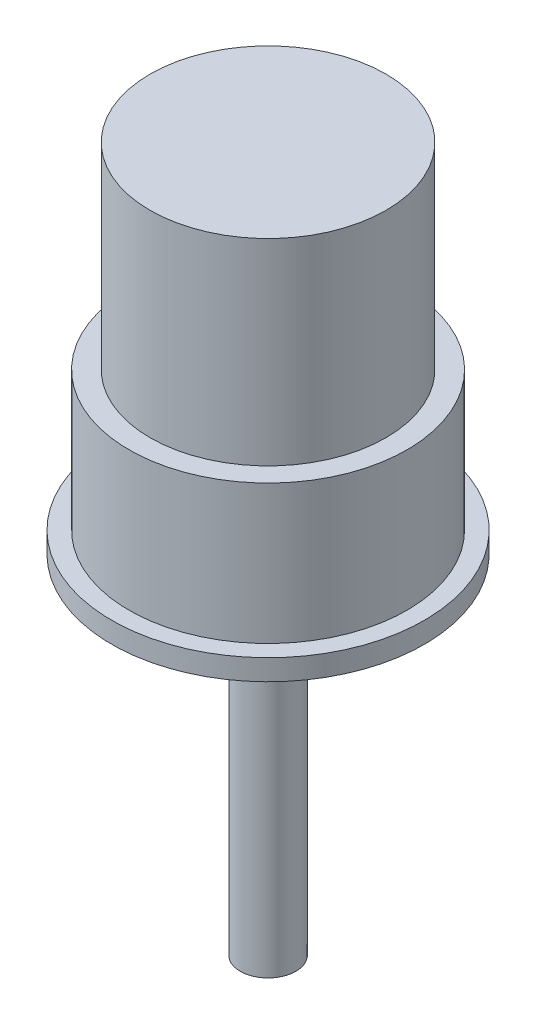
ISO-10303-21;
HEADER;
FILE_DESCRIPTION(('STEP AP214'),'2;1');
FILE_NAME('part.step','',(''),(''),'','','');
FILE_SCHEMA(('AUTOMOTIVE_DESIGN { 1 0 10303 214 1 1 1 1 }'));
ENDSEC;
DATA;
#1=APPLICATION_CONTEXT('core data for automotive mechanical design processes');
#2=APPLICATION_PROTOCOL_DEFINITION('international standard','automotive_design',2000,#1);
#3=PRODUCT_CONTEXT('',#1,'mechanical');
#4=PRODUCT('Part','Part','',(#3));
#5=PRODUCT_RELATED_PRODUCT_CATEGORY('part','',(#4));
#6=PRODUCT_DEFINITION_FORMATION('','',#4);
#7=PRODUCT_DEFINITION_CONTEXT('part definition',#1,'design');
#8=PRODUCT_DEFINITION('design','',#6,#7);
#9=PRODUCT_DEFINITION_SHAPE('','',#8);
#10=(LENGTH_UNIT() NAMED_UNIT(*) SI_UNIT(.MILLI.,.METRE.));
#11=(NAMED_UNIT(*) PLANE_ANGLE_UNIT() SI_UNIT($,.RADIAN.));
#12=(NAMED_UNIT(*) SI_UNIT($,.STERADIAN.) SOLID_ANGLE_UNIT());
#13=UNCERTAINTY_MEASURE_WITH_UNIT(LENGTH_MEASURE(1.E-05),#10,'distance_accuracy_value','');
#14=(GEOMETRIC_REPRESENTATION_CONTEXT(3) GLOBAL_UNCERTAINTY_ASSIGNED_CONTEXT((#13)) GLOBAL_UNIT_ASSIGNED_CONTEXT((#10,
#11,#12)) REPRESENTATION_CONTEXT('',''));
#15=CARTESIAN_POINT('',(0.,0.,0.));
#16=DIRECTION('',(0.,0.,1.));
#17=DIRECTION('',(1.,0.,0.));
#18=AXIS2_PLACEMENT_3D('',#15,#16,#17);
#19=CARTESIAN_POINT('',(0.,0.,0.));
#20=DIRECTION('',(0.,-1.,0.));
#21=DIRECTION('',(0.,0.,-1.));
#22=AXIS2_PLACEMENT_3D('',#19,#20,#21);
#23=PLANE('',#22);
#24=CARTESIAN_POINT('',(0.,0.,0.));
#25=DIRECTION('',(0.,-1.,0.));
#26=DIRECTION('',(0.,0.,-1.));
#27=AXIS2_PLACEMENT_3D('',#24,#25,#26);
#28=CIRCLE('',#27,16.9815);
#29=CARTESIAN_POINT('',(0.,0.,-16.9815));
#30=VERTEX_POINT('',#29);
#31=EDGE_CURVE('E10',#30,#30,#28,.T.);
#32=ORIENTED_EDGE('',*,*,#31,.F.);
#33=EDGE_LOOP('',(#32));
#34=FACE_BOUND('',#33,.T.);
#35=ADVANCED_FACE('F35',(#34),#23,.F.);
#36=CARTESIAN_POINT('',(0.,0.,0.));
#37=DIRECTION('',(0.,-1.,0.));
#38=DIRECTION('',(0.,0.,-1.));
#39=AXIS2_PLACEMENT_3D('',#36,#37,#38);
#40=CYLINDRICAL_SURFACE('',#39,16.9815);
#41=CARTESIAN_POINT('',(0.,-28.34,0.));
#42=DIRECTION('',(0.,-1.,0.));
#43=DIRECTION('',(0.,0.,-1.));
#44=AXIS2_PLACEMENT_3D('',#41,#42,#43);
#45=CIRCLE('',#44,16.9815);
#46=CARTESIAN_POINT('',(0.,-28.34,-16.9815));
#47=VERTEX_POINT('',#46);
#48=EDGE_CURVE('E41',#47,#47,#45,.T.);
#49=ORIENTED_EDGE('',*,*,#48,.F.);
#50=EDGE_LOOP('',(#49));
#51=FACE_BOUND('',#50,.T.);
#52=ORIENTED_EDGE('',*,*,#31,.T.);
#53=EDGE_LOOP('',(#52));
#54=FACE_BOUND('',#53,.T.);
#55=ADVANCED_FACE('F101',(#51,#54),#40,.T.);
#56=CARTESIAN_POINT('',(-16.9815,-28.34,0.));
#57=DIRECTION('',(0.,-1.,0.));
#58=DIRECTION('',(0.,0.,-1.));
#59=AXIS2_PLACEMENT_3D('',#56,#57,#58);
#60=PLANE('',#59);
#61=CARTESIAN_POINT('',(0.,-28.34,0.));
#62=DIRECTION('',(0.,-1.,0.));
#63=DIRECTION('',(0.,0.,-1.));
#64=AXIS2_PLACEMENT_3D('',#61,#62,#63);
#65=CIRCLE('',#64,20.);
#66=CARTESIAN_POINT('',(0.,-28.34,-20.));
#67=VERTEX_POINT('',#66);
#68=EDGE_CURVE('E45',#67,#67,#65,.T.);
#69=ORIENTED_EDGE('',*,*,#68,.F.);
#70=EDGE_LOOP('',(#69));
#71=FACE_BOUND('',#70,.T.);
#72=ORIENTED_EDGE('',*,*,#48,.T.);
#73=EDGE_LOOP('',(#72));
#74=FACE_BOUND('',#73,.T.);
#75=ADVANCED_FACE('F96',(#71,#74),#60,.F.);
#76=CARTESIAN_POINT('',(0.,0.,0.));
#77=DIRECTION('',(0.,-1.,0.));
#78=DIRECTION('',(0.,0.,-1.));
#79=AXIS2_PLACEMENT_3D('',#76,#77,#78);
#80=CYLINDRICAL_SURFACE('',#79,20.);
#81=CARTESIAN_POINT('',(0.,-48.34,0.));
#82=DIRECTION('',(0.,-1.,0.));
#83=DIRECTION('',(0.,0.,-1.));
#84=AXIS2_PLACEMENT_3D('',#81,#82,#83);
#85=CIRCLE('',#84,20.);
#86=CARTESIAN_POINT('',(0.,-48.34,-20.));
#87=VERTEX_POINT('',#86);
#88=EDGE_CURVE('E49',#87,#87,#85,.T.);
#89=ORIENTED_EDGE('',*,*,#88,.F.);
#90=EDGE_LOOP('',(#89));
#91=FACE_BOUND('',#90,.T.);
#92=ORIENTED_EDGE('',*,*,#68,.T.);
#93=EDGE_LOOP('',(#92));
#94=FACE_BOUND('',#93,.T.);
#95=ADVANCED_FACE('F90',(#91,#94),#80,.T.);
#96=CARTESIAN_POINT('',(-20.,-48.34,0.));
#97=DIRECTION('',(0.,-1.,0.));
#98=DIRECTION('',(0.,0.,-1.));
#99=AXIS2_PLACEMENT_3D('',#96,#97,#98);
#100=PLANE('',#99);
#101=CARTESIAN_POINT('',(0.,-48.34,0.));
#102=DIRECTION('',(0.,-1.,0.));
#103=DIRECTION('',(0.,0.,-1.));
#104=AXIS2_PLACEMENT_3D('',#101,#102,#103);
#105=CIRCLE('',#104,22.5);
#106=CARTESIAN_POINT('',(0.,-48.34,-22.5));
#107=VERTEX_POINT('',#106);
#108=EDGE_CURVE('E54',#107,#107,#105,.T.);
#109=ORIENTED_EDGE('',*,*,#108,.F.);
#110=EDGE_LOOP('',(#109));
#111=FACE_BOUND('',#110,.T.);
#112=ORIENTED_EDGE('',*,*,#88,.T.);
#113=EDGE_LOOP('',(#112));
#114=FACE_BOUND('',#113,.T.);
#115=ADVANCED_FACE('F84',(#111,#114),#100,.F.);
#116=CARTESIAN_POINT('',(0.,0.,0.));
#117=DIRECTION('',(0.,-1.,0.));
#118=DIRECTION('',(0.,0.,-1.));
#119=AXIS2_PLACEMENT_3D('',#116,#117,#118);
#120=CYLINDRICAL_SURFACE('',#119,22.5);
#121=CARTESIAN_POINT('',(0.,-51.34,0.));
#122=DIRECTION('',(0.,-1.,0.));
#123=DIRECTION('',(0.,0.,-1.));
#124=AXIS2_PLACEMENT_3D('',#121,#122,#123);
#125=CIRCLE('',#124,22.5);
#126=CARTESIAN_POINT('',(0.,-51.34,-22.5));
#127=VERTEX_POINT('',#126);
#128=EDGE_CURVE('E57',#127,#127,#125,.T.);
#129=ORIENTED_EDGE('',*,*,#128,.F.);
#130=EDGE_LOOP('',(#129));
#131=FACE_BOUND('',#130,.T.);
#132=ORIENTED_EDGE('',*,*,#108,.T.);
#133=EDGE_LOOP('',(#132));
#134=FACE_BOUND('',#133,.T.);
#135=ADVANCED_FACE('F78',(#131,#134),#120,.T.);
#136=CARTESIAN_POINT('',(-22.5,-51.34,0.));
#137=DIRECTION('',(0.,1.,0.));
#138=DIRECTION('',(0.,0.,1.));
#139=AXIS2_PLACEMENT_3D('',#136,#137,#138);
#140=PLANE('',#139);
#141=CARTESIAN_POINT('',(0.,-51.34,0.));
#142=DIRECTION('',(0.,-1.,0.));
#143=DIRECTION('',(0.,0.,-1.));
#144=AXIS2_PLACEMENT_3D('',#141,#142,#143);
#145=CIRCLE('',#144,4.);
#146=CARTESIAN_POINT('',(0.,-51.34,-4.));
#147=VERTEX_POINT('',#146);
#148=EDGE_CURVE('E60',#147,#147,#145,.T.);
#149=ORIENTED_EDGE('',*,*,#148,.F.);
#150=EDGE_LOOP('',(#149));
#151=FACE_BOUND('',#150,.T.);
#152=ORIENTED_EDGE('',*,*,#128,.T.);
#153=EDGE_LOOP('',(#152));
#154=FACE_BOUND('',#153,.T.);
#155=ADVANCED_FACE('F72',(#151,#154),#140,.F.);
#156=CARTESIAN_POINT('',(0.,0.,0.));
#157=DIRECTION('',(0.,-1.,0.));
#158=DIRECTION('',(0.,0.,-1.));
#159=AXIS2_PLACEMENT_3D('',#156,#157,#158);
#160=CYLINDRICAL_SURFACE('',#159,4.);
#161=CARTESIAN_POINT('',(0.,-101.34,0.));
#162=DIRECTION('',(0.,-1.,0.));
#163=DIRECTION('',(0.,0.,-1.));
#164=AXIS2_PLACEMENT_3D('',#161,#162,#163);
#165=CIRCLE('',#164,3.99999999999999);
#166=CARTESIAN_POINT('',(0.,-101.34,-3.99999999999999));
#167=VERTEX_POINT('',#166);
#168=EDGE_CURVE('E63',#167,#167,#165,.T.);
#169=ORIENTED_EDGE('',*,*,#168,.F.);
#170=EDGE_LOOP('',(#169));
#171=FACE_BOUND('',#170,.T.);
#172=ORIENTED_EDGE('',*,*,#148,.T.);
#173=EDGE_LOOP('',(#172));
#174=FACE_BOUND('',#173,.T.);
#175=ADVANCED_FACE('F69',(#171,#174),#160,.T.);
#176=CARTESIAN_POINT('',(-3.99999999999999,-101.34,0.));
#177=DIRECTION('',(0.,1.,0.));
#178=DIRECTION('',(0.,0.,1.));
#179=AXIS2_PLACEMENT_3D('',#176,#177,#178);
#180=PLANE('',#179);
#181=ORIENTED_EDGE('',*,*,#168,.T.);
#182=EDGE_LOOP('',(#181));
#183=FACE_BOUND('',#182,.T.);
#184=ADVANCED_FACE('F67',(#183),#180,.F.);
#185=CLOSED_SHELL('',(#35,#55,#75,#95,#115,#135,#155,#175,#184));
#186=MANIFOLD_SOLID_BREP('B2',#185);
#187=ADVANCED_BREP_SHAPE_REPRESENTATION('',(#18,#186),#14);
#188=SHAPE_DEFINITION_REPRESENTATION(#9,#187);
ENDSEC;
END-ISO-10303-21;
